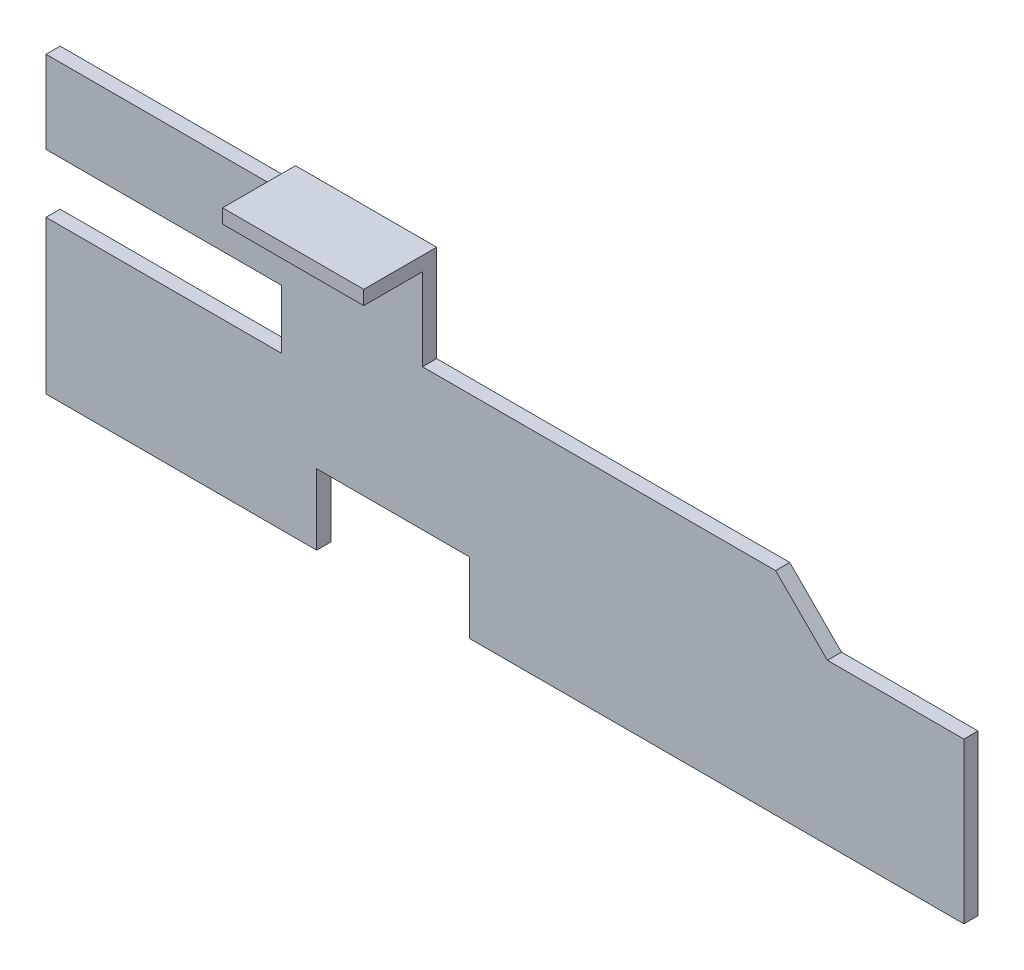
ISO-10303-21;
HEADER;
FILE_DESCRIPTION(('STEP AP214'),'2;1');
FILE_NAME('part.step','',(''),(''),'','','');
FILE_SCHEMA(('AUTOMOTIVE_DESIGN { 1 0 10303 214 1 1 1 1 }'));
ENDSEC;
DATA;
#1=APPLICATION_CONTEXT('core data for automotive mechanical design processes');
#2=APPLICATION_PROTOCOL_DEFINITION('international standard','automotive_design',2000,#1);
#3=PRODUCT_CONTEXT('',#1,'mechanical');
#4=PRODUCT('Part','Part','',(#3));
#5=PRODUCT_RELATED_PRODUCT_CATEGORY('part','',(#4));
#6=PRODUCT_DEFINITION_FORMATION('','',#4);
#7=PRODUCT_DEFINITION_CONTEXT('part definition',#1,'design');
#8=PRODUCT_DEFINITION('design','',#6,#7);
#9=PRODUCT_DEFINITION_SHAPE('','',#8);
#10=(LENGTH_UNIT() NAMED_UNIT(*) SI_UNIT(.MILLI.,.METRE.));
#11=(NAMED_UNIT(*) PLANE_ANGLE_UNIT() SI_UNIT($,.RADIAN.));
#12=(NAMED_UNIT(*) SI_UNIT($,.STERADIAN.) SOLID_ANGLE_UNIT());
#13=UNCERTAINTY_MEASURE_WITH_UNIT(LENGTH_MEASURE(1.E-05),#10,'distance_accuracy_value','');
#14=(GEOMETRIC_REPRESENTATION_CONTEXT(3) GLOBAL_UNCERTAINTY_ASSIGNED_CONTEXT((#13)) GLOBAL_UNIT_ASSIGNED_CONTEXT((#10,
#11,#12)) REPRESENTATION_CONTEXT('',''));
#15=CARTESIAN_POINT('',(0.,0.,0.));
#16=DIRECTION('',(0.,0.,1.));
#17=DIRECTION('',(1.,0.,0.));
#18=AXIS2_PLACEMENT_3D('',#15,#16,#17);
#19=CARTESIAN_POINT('',(0.,6.5,0.6));
#20=DIRECTION('',(1.,0.,0.));
#21=DIRECTION('',(0.,1.,0.));
#22=AXIS2_PLACEMENT_3D('',#19,#20,#21);
#23=PLANE('',#22);
#24=DIRECTION('',(0.,-1.,0.));
#25=VECTOR('',#24,1.);
#26=CARTESIAN_POINT('',(0.,6.5,0.));
#27=LINE('',#26,#25);
#28=CARTESIAN_POINT('',(0.,6.5,0.));
#29=VERTEX_POINT('',#28);
#30=CARTESIAN_POINT('',(0.,0.,0.));
#31=VERTEX_POINT('',#30);
#32=EDGE_CURVE('E185',#29,#31,#27,.T.);
#33=ORIENTED_EDGE('',*,*,#32,.T.);
#34=DIRECTION('',(0.,0.,-1.));
#35=VECTOR('',#34,1.);
#36=CARTESIAN_POINT('',(0.,0.,0.6));
#37=LINE('',#36,#35);
#38=CARTESIAN_POINT('',(0.,0.,0.6));
#39=VERTEX_POINT('',#38);
#40=EDGE_CURVE('E11',#39,#31,#37,.T.);
#41=ORIENTED_EDGE('',*,*,#40,.F.);
#42=DIRECTION('',(0.,-1.,0.));
#43=VECTOR('',#42,1.);
#44=CARTESIAN_POINT('',(0.,6.5,0.6));
#45=LINE('',#44,#43);
#46=CARTESIAN_POINT('',(0.,6.5,0.6));
#47=VERTEX_POINT('',#46);
#48=EDGE_CURVE('E219',#47,#39,#45,.T.);
#49=ORIENTED_EDGE('',*,*,#48,.F.);
#50=DIRECTION('',(0.,0.,-1.));
#51=VECTOR('',#50,1.);
#52=CARTESIAN_POINT('',(0.,6.5,0.6));
#53=LINE('',#52,#51);
#54=EDGE_CURVE('E181',#47,#29,#53,.T.);
#55=ORIENTED_EDGE('',*,*,#54,.T.);
#56=EDGE_LOOP('',(#33,#41,#49,#55));
#57=FACE_BOUND('',#56,.T.);
#58=ADVANCED_FACE('F35',(#57),#23,.F.);
#59=CARTESIAN_POINT('',(0.,0.,0.6));
#60=DIRECTION('',(0.,1.,0.));
#61=DIRECTION('',(0.,0.,1.));
#62=AXIS2_PLACEMENT_3D('',#59,#60,#61);
#63=PLANE('',#62);
#64=DIRECTION('',(1.,0.,0.));
#65=VECTOR('',#64,1.);
#66=CARTESIAN_POINT('',(0.,0.,0.));
#67=LINE('',#66,#65);
#68=CARTESIAN_POINT('',(11.5,0.,0.));
#69=VERTEX_POINT('',#68);
#70=EDGE_CURVE('E188',#31,#69,#67,.T.);
#71=ORIENTED_EDGE('',*,*,#70,.T.);
#72=DIRECTION('',(0.,0.,-1.));
#73=VECTOR('',#72,1.);
#74=CARTESIAN_POINT('',(11.5,0.,0.6));
#75=LINE('',#74,#73);
#76=CARTESIAN_POINT('',(11.5,0.,0.6));
#77=VERTEX_POINT('',#76);
#78=EDGE_CURVE('E44',#77,#69,#75,.T.);
#79=ORIENTED_EDGE('',*,*,#78,.F.);
#80=DIRECTION('',(1.,0.,0.));
#81=VECTOR('',#80,1.);
#82=CARTESIAN_POINT('',(0.,0.,0.6));
#83=LINE('',#82,#81);
#84=EDGE_CURVE('E121',#39,#77,#83,.T.);
#85=ORIENTED_EDGE('',*,*,#84,.F.);
#86=ORIENTED_EDGE('',*,*,#40,.T.);
#87=EDGE_LOOP('',(#71,#79,#85,#86));
#88=FACE_BOUND('',#87,.T.);
#89=ADVANCED_FACE('F298',(#88),#63,.F.);
#90=CARTESIAN_POINT('',(11.5,0.,0.6));
#91=DIRECTION('',(-1.,0.,0.));
#92=DIRECTION('',(0.,0.,1.));
#93=AXIS2_PLACEMENT_3D('',#90,#91,#92);
#94=PLANE('',#93);
#95=DIRECTION('',(0.,1.,0.));
#96=VECTOR('',#95,1.);
#97=CARTESIAN_POINT('',(11.5,0.,0.));
#98=LINE('',#97,#96);
#99=CARTESIAN_POINT('',(11.5,3.,0.));
#100=VERTEX_POINT('',#99);
#101=EDGE_CURVE('E191',#69,#100,#98,.T.);
#102=ORIENTED_EDGE('',*,*,#101,.T.);
#103=DIRECTION('',(0.,0.,-1.));
#104=VECTOR('',#103,1.);
#105=CARTESIAN_POINT('',(11.5,3.,0.6));
#106=LINE('',#105,#104);
#107=CARTESIAN_POINT('',(11.5,3.,0.6));
#108=VERTEX_POINT('',#107);
#109=EDGE_CURVE('E250',#108,#100,#106,.T.);
#110=ORIENTED_EDGE('',*,*,#109,.F.);
#111=DIRECTION('',(0.,1.,0.));
#112=VECTOR('',#111,1.);
#113=CARTESIAN_POINT('',(11.5,0.,0.6));
#114=LINE('',#113,#112);
#115=EDGE_CURVE('E483',#77,#108,#114,.T.);
#116=ORIENTED_EDGE('',*,*,#115,.F.);
#117=ORIENTED_EDGE('',*,*,#78,.T.);
#118=EDGE_LOOP('',(#102,#110,#116,#117));
#119=FACE_BOUND('',#118,.T.);
#120=ADVANCED_FACE('F302',(#119),#94,.F.);
#121=CARTESIAN_POINT('',(11.5,3.,0.6));
#122=DIRECTION('',(0.,1.,0.));
#123=DIRECTION('',(0.,0.,1.));
#124=AXIS2_PLACEMENT_3D('',#121,#122,#123);
#125=PLANE('',#124);
#126=DIRECTION('',(1.,0.,0.));
#127=VECTOR('',#126,1.);
#128=CARTESIAN_POINT('',(11.5,3.,0.));
#129=LINE('',#128,#127);
#130=CARTESIAN_POINT('',(18.,3.,0.));
#131=VERTEX_POINT('',#130);
#132=EDGE_CURVE('E193',#100,#131,#129,.T.);
#133=ORIENTED_EDGE('',*,*,#132,.T.);
#134=DIRECTION('',(0.,0.,-1.));
#135=VECTOR('',#134,1.);
#136=CARTESIAN_POINT('',(18.,3.,0.6));
#137=LINE('',#136,#135);
#138=CARTESIAN_POINT('',(18.,3.,0.6));
#139=VERTEX_POINT('',#138);
#140=EDGE_CURVE('E247',#139,#131,#137,.T.);
#141=ORIENTED_EDGE('',*,*,#140,.F.);
#142=DIRECTION('',(1.,0.,0.));
#143=VECTOR('',#142,1.);
#144=CARTESIAN_POINT('',(11.5,3.,0.6));
#145=LINE('',#144,#143);
#146=EDGE_CURVE('E480',#108,#139,#145,.T.);
#147=ORIENTED_EDGE('',*,*,#146,.F.);
#148=ORIENTED_EDGE('',*,*,#109,.T.);
#149=EDGE_LOOP('',(#133,#141,#147,#148));
#150=FACE_BOUND('',#149,.T.);
#151=ADVANCED_FACE('F306',(#150),#125,.F.);
#152=CARTESIAN_POINT('',(18.,3.,0.6));
#153=DIRECTION('',(1.,0.,0.));
#154=DIRECTION('',(0.,0.,-1.));
#155=AXIS2_PLACEMENT_3D('',#152,#153,#154);
#156=PLANE('',#155);
#157=DIRECTION('',(0.,-1.,0.));
#158=VECTOR('',#157,1.);
#159=CARTESIAN_POINT('',(18.,3.,0.));
#160=LINE('',#159,#158);
#161=CARTESIAN_POINT('',(18.,0.,0.));
#162=VERTEX_POINT('',#161);
#163=EDGE_CURVE('E195',#131,#162,#160,.T.);
#164=ORIENTED_EDGE('',*,*,#163,.T.);
#165=DIRECTION('',(0.,0.,-1.));
#166=VECTOR('',#165,1.);
#167=CARTESIAN_POINT('',(18.,0.,0.6));
#168=LINE('',#167,#166);
#169=CARTESIAN_POINT('',(18.,0.,0.6));
#170=VERTEX_POINT('',#169);
#171=EDGE_CURVE('E244',#170,#162,#168,.T.);
#172=ORIENTED_EDGE('',*,*,#171,.F.);
#173=DIRECTION('',(0.,-1.,0.));
#174=VECTOR('',#173,1.);
#175=CARTESIAN_POINT('',(18.,3.,0.6));
#176=LINE('',#175,#174);
#177=EDGE_CURVE('E477',#139,#170,#176,.T.);
#178=ORIENTED_EDGE('',*,*,#177,.F.);
#179=ORIENTED_EDGE('',*,*,#140,.T.);
#180=EDGE_LOOP('',(#164,#172,#178,#179));
#181=FACE_BOUND('',#180,.T.);
#182=ADVANCED_FACE('F312',(#181),#156,.F.);
#183=CARTESIAN_POINT('',(18.,0.,0.6));
#184=DIRECTION('',(0.,1.,0.));
#185=DIRECTION('',(0.,0.,1.));
#186=AXIS2_PLACEMENT_3D('',#183,#184,#185);
#187=PLANE('',#186);
#188=DIRECTION('',(1.,0.,0.));
#189=VECTOR('',#188,1.);
#190=CARTESIAN_POINT('',(18.,0.,0.));
#191=LINE('',#190,#189);
#192=CARTESIAN_POINT('',(39.,0.,0.));
#193=VERTEX_POINT('',#192);
#194=EDGE_CURVE('E197',#162,#193,#191,.T.);
#195=ORIENTED_EDGE('',*,*,#194,.T.);
#196=DIRECTION('',(0.,0.,-1.));
#197=VECTOR('',#196,1.);
#198=CARTESIAN_POINT('',(39.,0.,0.6));
#199=LINE('',#198,#197);
#200=CARTESIAN_POINT('',(39.,0.,0.6));
#201=VERTEX_POINT('',#200);
#202=EDGE_CURVE('E241',#201,#193,#199,.T.);
#203=ORIENTED_EDGE('',*,*,#202,.F.);
#204=DIRECTION('',(1.,0.,0.));
#205=VECTOR('',#204,1.);
#206=CARTESIAN_POINT('',(18.,0.,0.6));
#207=LINE('',#206,#205);
#208=EDGE_CURVE('E475',#170,#201,#207,.T.);
#209=ORIENTED_EDGE('',*,*,#208,.F.);
#210=ORIENTED_EDGE('',*,*,#171,.T.);
#211=EDGE_LOOP('',(#195,#203,#209,#210));
#212=FACE_BOUND('',#211,.T.);
#213=ADVANCED_FACE('F316',(#212),#187,.F.);
#214=CARTESIAN_POINT('',(39.,0.,0.6));
#215=DIRECTION('',(-1.,0.,0.));
#216=DIRECTION('',(0.,-1.,0.));
#217=AXIS2_PLACEMENT_3D('',#214,#215,#216);
#218=PLANE('',#217);
#219=DIRECTION('',(0.,1.,0.));
#220=VECTOR('',#219,1.);
#221=CARTESIAN_POINT('',(39.,0.,0.));
#222=LINE('',#221,#220);
#223=CARTESIAN_POINT('',(39.,6.8,0.));
#224=VERTEX_POINT('',#223);
#225=EDGE_CURVE('E199',#193,#224,#222,.T.);
#226=ORIENTED_EDGE('',*,*,#225,.T.);
#227=DIRECTION('',(0.,0.,-1.));
#228=VECTOR('',#227,1.);
#229=CARTESIAN_POINT('',(39.,6.8,0.6));
#230=LINE('',#229,#228);
#231=CARTESIAN_POINT('',(39.,6.8,0.6));
#232=VERTEX_POINT('',#231);
#233=EDGE_CURVE('E238',#232,#224,#230,.T.);
#234=ORIENTED_EDGE('',*,*,#233,.F.);
#235=DIRECTION('',(0.,1.,0.));
#236=VECTOR('',#235,1.);
#237=CARTESIAN_POINT('',(39.,0.,0.6));
#238=LINE('',#237,#236);
#239=EDGE_CURVE('E468',#201,#232,#238,.T.);
#240=ORIENTED_EDGE('',*,*,#239,.F.);
#241=ORIENTED_EDGE('',*,*,#202,.T.);
#242=EDGE_LOOP('',(#226,#234,#240,#241));
#243=FACE_BOUND('',#242,.T.);
#244=ADVANCED_FACE('F320',(#243),#218,.F.);
#245=CARTESIAN_POINT('',(39.,6.8,0.6));
#246=DIRECTION('',(0.,-1.,0.));
#247=DIRECTION('',(1.,0.,0.));
#248=AXIS2_PLACEMENT_3D('',#245,#246,#247);
#249=PLANE('',#248);
#250=DIRECTION('',(-1.,0.,0.));
#251=VECTOR('',#250,1.);
#252=CARTESIAN_POINT('',(39.,6.8,0.));
#253=LINE('',#252,#251);
#254=CARTESIAN_POINT('',(33.2,6.8,0.));
#255=VERTEX_POINT('',#254);
#256=EDGE_CURVE('E201',#224,#255,#253,.T.);
#257=ORIENTED_EDGE('',*,*,#256,.T.);
#258=DIRECTION('',(0.,0.,-1.));
#259=VECTOR('',#258,1.);
#260=CARTESIAN_POINT('',(33.2,6.8,0.6));
#261=LINE('',#260,#259);
#262=CARTESIAN_POINT('',(33.2,6.8,0.6));
#263=VERTEX_POINT('',#262);
#264=EDGE_CURVE('E235',#263,#255,#261,.T.);
#265=ORIENTED_EDGE('',*,*,#264,.F.);
#266=DIRECTION('',(-1.,0.,0.));
#267=VECTOR('',#266,1.);
#268=CARTESIAN_POINT('',(39.,6.8,0.6));
#269=LINE('',#268,#267);
#270=EDGE_CURVE('E465',#232,#263,#269,.T.);
#271=ORIENTED_EDGE('',*,*,#270,.F.);
#272=ORIENTED_EDGE('',*,*,#233,.T.);
#273=EDGE_LOOP('',(#257,#265,#271,#272));
#274=FACE_BOUND('',#273,.T.);
#275=ADVANCED_FACE('F324',(#274),#249,.F.);
#276=CARTESIAN_POINT('',(33.2,6.8,0.6));
#277=DIRECTION('',(-0.707106781186547,-0.707106781186548,0.));
#278=DIRECTION('',(0.707106781186548,-0.707106781186547,0.));
#279=AXIS2_PLACEMENT_3D('',#276,#277,#278);
#280=PLANE('',#279);
#281=DIRECTION('',(-0.707106781186548,0.707106781186547,0.));
#282=VECTOR('',#281,1.);
#283=CARTESIAN_POINT('',(33.2,6.8,0.));
#284=LINE('',#283,#282);
#285=CARTESIAN_POINT('',(31.,9.,0.));
#286=VERTEX_POINT('',#285);
#287=EDGE_CURVE('E203',#255,#286,#284,.T.);
#288=ORIENTED_EDGE('',*,*,#287,.T.);
#289=DIRECTION('',(0.,0.,-1.));
#290=VECTOR('',#289,1.);
#291=CARTESIAN_POINT('',(31.,9.,0.6));
#292=LINE('',#291,#290);
#293=CARTESIAN_POINT('',(31.,9.,0.6));
#294=VERTEX_POINT('',#293);
#295=EDGE_CURVE('E232',#294,#286,#292,.T.);
#296=ORIENTED_EDGE('',*,*,#295,.F.);
#297=DIRECTION('',(-0.707106781186548,0.707106781186547,0.));
#298=VECTOR('',#297,1.);
#299=CARTESIAN_POINT('',(33.2,6.8,0.6));
#300=LINE('',#299,#298);
#301=EDGE_CURVE('E463',#263,#294,#300,.T.);
#302=ORIENTED_EDGE('',*,*,#301,.F.);
#303=ORIENTED_EDGE('',*,*,#264,.T.);
#304=EDGE_LOOP('',(#288,#296,#302,#303));
#305=FACE_BOUND('',#304,.T.);
#306=ADVANCED_FACE('F328',(#305),#280,.F.);
#307=CARTESIAN_POINT('',(31.,9.,0.6));
#308=DIRECTION('',(0.,-1.,0.));
#309=DIRECTION('',(1.,0.,0.));
#310=AXIS2_PLACEMENT_3D('',#307,#308,#309);
#311=PLANE('',#310);
#312=DIRECTION('',(-1.,0.,0.));
#313=VECTOR('',#312,1.);
#314=CARTESIAN_POINT('',(31.,9.,0.));
#315=LINE('',#314,#313);
#316=CARTESIAN_POINT('',(16.,8.99999999999999,0.));
#317=VERTEX_POINT('',#316);
#318=EDGE_CURVE('E205',#286,#317,#315,.T.);
#319=ORIENTED_EDGE('',*,*,#318,.T.);
#320=DIRECTION('',(0.,0.,-1.));
#321=VECTOR('',#320,1.);
#322=CARTESIAN_POINT('',(16.,8.99999999999999,0.6));
#323=LINE('',#322,#321);
#324=CARTESIAN_POINT('',(16.,8.99999999999999,0.6));
#325=VERTEX_POINT('',#324);
#326=EDGE_CURVE('E229',#325,#317,#323,.T.);
#327=ORIENTED_EDGE('',*,*,#326,.F.);
#328=DIRECTION('',(-1.,0.,0.));
#329=VECTOR('',#328,1.);
#330=CARTESIAN_POINT('',(31.,9.,0.6));
#331=LINE('',#330,#329);
#332=EDGE_CURVE('E260',#294,#325,#331,.T.);
#333=ORIENTED_EDGE('',*,*,#332,.F.);
#334=ORIENTED_EDGE('',*,*,#295,.T.);
#335=EDGE_LOOP('',(#319,#327,#333,#334));
#336=FACE_BOUND('',#335,.T.);
#337=ADVANCED_FACE('F332',(#336),#311,.F.);
#338=CARTESIAN_POINT('',(16.,8.99999999999999,0.6));
#339=DIRECTION('',(-1.,0.,0.));
#340=DIRECTION('',(0.,0.,1.));
#341=AXIS2_PLACEMENT_3D('',#338,#339,#340);
#342=PLANE('',#341);
#343=DIRECTION('',(0.,1.,0.));
#344=VECTOR('',#343,1.);
#345=CARTESIAN_POINT('',(16.,8.99999999999999,0.));
#346=LINE('',#345,#344);
#347=CARTESIAN_POINT('',(16.,13.1,0.));
#348=VERTEX_POINT('',#347);
#349=EDGE_CURVE('E207',#317,#348,#346,.T.);
#350=ORIENTED_EDGE('',*,*,#349,.T.);
#351=DIRECTION('',(0.,0.,-1.));
#352=VECTOR('',#351,1.);
#353=CARTESIAN_POINT('',(16.,13.1,3.1));
#354=LINE('',#353,#352);
#355=CARTESIAN_POINT('',(16.,13.1,3.1));
#356=VERTEX_POINT('',#355);
#357=EDGE_CURVE('E438',#356,#348,#354,.T.);
#358=ORIENTED_EDGE('',*,*,#357,.F.);
#359=DIRECTION('',(0.,1.,0.));
#360=VECTOR('',#359,1.);
#361=CARTESIAN_POINT('',(16.,12.5,3.1));
#362=LINE('',#361,#360);
#363=CARTESIAN_POINT('',(16.,12.5,3.1));
#364=VERTEX_POINT('',#363);
#365=EDGE_CURVE('E499',#364,#356,#362,.T.);
#366=ORIENTED_EDGE('',*,*,#365,.F.);
#367=DIRECTION('',(0.,0.,-1.));
#368=VECTOR('',#367,1.);
#369=CARTESIAN_POINT('',(16.,12.5,3.1));
#370=LINE('',#369,#368);
#371=CARTESIAN_POINT('',(16.,12.5,0.6));
#372=VERTEX_POINT('',#371);
#373=EDGE_CURVE('E448',#364,#372,#370,.T.);
#374=ORIENTED_EDGE('',*,*,#373,.T.);
#375=DIRECTION('',(0.,1.,0.));
#376=VECTOR('',#375,1.);
#377=CARTESIAN_POINT('',(16.,8.99999999999999,0.6));
#378=LINE('',#377,#376);
#379=EDGE_CURVE('E255',#325,#372,#378,.T.);
#380=ORIENTED_EDGE('',*,*,#379,.F.);
#381=ORIENTED_EDGE('',*,*,#326,.T.);
#382=EDGE_LOOP('',(#350,#358,#366,#374,#380,#381));
#383=FACE_BOUND('',#382,.T.);
#384=ADVANCED_FACE('F336',(#383),#342,.F.);
#385=CARTESIAN_POINT('',(10.,15.,0.6));
#386=DIRECTION('',(1.,0.,0.));
#387=DIRECTION('',(0.,0.,-1.));
#388=AXIS2_PLACEMENT_3D('',#385,#386,#387);
#389=PLANE('',#388);
#390=DIRECTION('',(0.,0.,-1.));
#391=VECTOR('',#390,1.);
#392=CARTESIAN_POINT('',(10.,13.1,3.1));
#393=LINE('',#392,#391);
#394=CARTESIAN_POINT('',(10.,13.1,3.1));
#395=VERTEX_POINT('',#394);
#396=CARTESIAN_POINT('',(10.,13.1,0.));
#397=VERTEX_POINT('',#396);
#398=EDGE_CURVE('E449',#395,#397,#393,.T.);
#399=ORIENTED_EDGE('',*,*,#398,.T.);
#400=DIRECTION('',(0.,-1.,0.));
#401=VECTOR('',#400,1.);
#402=CARTESIAN_POINT('',(10.,15.,0.));
#403=LINE('',#402,#401);
#404=CARTESIAN_POINT('',(10.,12.5,0.));
#405=VERTEX_POINT('',#404);
#406=EDGE_CURVE('E210',#397,#405,#403,.T.);
#407=ORIENTED_EDGE('',*,*,#406,.T.);
#408=DIRECTION('',(0.,0.,-1.));
#409=VECTOR('',#408,1.);
#410=CARTESIAN_POINT('',(10.,12.5,0.6));
#411=LINE('',#410,#409);
#412=CARTESIAN_POINT('',(10.,12.5,0.6));
#413=VERTEX_POINT('',#412);
#414=EDGE_CURVE('E226',#413,#405,#411,.T.);
#415=ORIENTED_EDGE('',*,*,#414,.F.);
#416=DIRECTION('',(0.,0.,-1.));
#417=VECTOR('',#416,1.);
#418=CARTESIAN_POINT('',(10.,12.5,3.1));
#419=LINE('',#418,#417);
#420=CARTESIAN_POINT('',(10.,12.5,3.1));
#421=VERTEX_POINT('',#420);
#422=EDGE_CURVE('E189',#421,#413,#419,.T.);
#423=ORIENTED_EDGE('',*,*,#422,.F.);
#424=DIRECTION('',(0.,-1.,0.));
#425=VECTOR('',#424,1.);
#426=CARTESIAN_POINT('',(10.,12.5,3.1));
#427=LINE('',#426,#425);
#428=EDGE_CURVE('E497',#395,#421,#427,.T.);
#429=ORIENTED_EDGE('',*,*,#428,.F.);
#430=EDGE_LOOP('',(#399,#407,#415,#423,#429));
#431=FACE_BOUND('',#430,.T.);
#432=ADVANCED_FACE('F340',(#431),#389,.F.);
#433=CARTESIAN_POINT('',(10.,12.5,0.6));
#434=DIRECTION('',(0.,-1.,0.));
#435=DIRECTION('',(1.,0.,0.));
#436=AXIS2_PLACEMENT_3D('',#433,#434,#435);
#437=PLANE('',#436);
#438=DIRECTION('',(-1.,0.,0.));
#439=VECTOR('',#438,1.);
#440=CARTESIAN_POINT('',(10.,12.5,0.));
#441=LINE('',#440,#439);
#442=CARTESIAN_POINT('',(0.,12.5,0.));
#443=VERTEX_POINT('',#442);
#444=EDGE_CURVE('E212',#405,#443,#441,.T.);
#445=ORIENTED_EDGE('',*,*,#444,.T.);
#446=DIRECTION('',(0.,0.,-1.));
#447=VECTOR('',#446,1.);
#448=CARTESIAN_POINT('',(0.,12.5,0.6));
#449=LINE('',#448,#447);
#450=CARTESIAN_POINT('',(0.,12.5,0.6));
#451=VERTEX_POINT('',#450);
#452=EDGE_CURVE('E223',#451,#443,#449,.T.);
#453=ORIENTED_EDGE('',*,*,#452,.F.);
#454=DIRECTION('',(-1.,0.,0.));
#455=VECTOR('',#454,1.);
#456=CARTESIAN_POINT('',(10.,12.5,0.6));
#457=LINE('',#456,#455);
#458=EDGE_CURVE('E259',#413,#451,#457,.T.);
#459=ORIENTED_EDGE('',*,*,#458,.F.);
#460=ORIENTED_EDGE('',*,*,#414,.T.);
#461=EDGE_LOOP('',(#445,#453,#459,#460));
#462=FACE_BOUND('',#461,.T.);
#463=ADVANCED_FACE('F274',(#462),#437,.F.);
#464=CARTESIAN_POINT('',(0.,12.5,0.6));
#465=DIRECTION('',(1.,0.,0.));
#466=DIRECTION('',(0.,1.,0.));
#467=AXIS2_PLACEMENT_3D('',#464,#465,#466);
#468=PLANE('',#467);
#469=DIRECTION('',(0.,-1.,0.));
#470=VECTOR('',#469,1.);
#471=CARTESIAN_POINT('',(0.,12.5,0.));
#472=LINE('',#471,#470);
#473=CARTESIAN_POINT('',(0.,9.,0.));
#474=VERTEX_POINT('',#473);
#475=EDGE_CURVE('E214',#443,#474,#472,.T.);
#476=ORIENTED_EDGE('',*,*,#475,.T.);
#477=DIRECTION('',(0.,0.,-1.));
#478=VECTOR('',#477,1.);
#479=CARTESIAN_POINT('',(0.,9.,0.6));
#480=LINE('',#479,#478);
#481=CARTESIAN_POINT('',(0.,9.,0.6));
#482=VERTEX_POINT('',#481);
#483=EDGE_CURVE('E176',#482,#474,#480,.T.);
#484=ORIENTED_EDGE('',*,*,#483,.F.);
#485=DIRECTION('',(0.,-1.,0.));
#486=VECTOR('',#485,1.);
#487=CARTESIAN_POINT('',(0.,12.5,0.6));
#488=LINE('',#487,#486);
#489=EDGE_CURVE('E167',#451,#482,#488,.T.);
#490=ORIENTED_EDGE('',*,*,#489,.F.);
#491=ORIENTED_EDGE('',*,*,#452,.T.);
#492=EDGE_LOOP('',(#476,#484,#490,#491));
#493=FACE_BOUND('',#492,.T.);
#494=ADVANCED_FACE('F278',(#493),#468,.F.);
#495=CARTESIAN_POINT('',(0.,9.,0.6));
#496=DIRECTION('',(0.,1.,0.));
#497=DIRECTION('',(0.,0.,1.));
#498=AXIS2_PLACEMENT_3D('',#495,#496,#497);
#499=PLANE('',#498);
#500=DIRECTION('',(1.,0.,0.));
#501=VECTOR('',#500,1.);
#502=CARTESIAN_POINT('',(0.,9.,0.));
#503=LINE('',#502,#501);
#504=CARTESIAN_POINT('',(10.,9.,0.));
#505=VERTEX_POINT('',#504);
#506=EDGE_CURVE('E175',#474,#505,#503,.T.);
#507=ORIENTED_EDGE('',*,*,#506,.T.);
#508=DIRECTION('',(0.,0.,-1.));
#509=VECTOR('',#508,1.);
#510=CARTESIAN_POINT('',(10.,9.,0.6));
#511=LINE('',#510,#509);
#512=CARTESIAN_POINT('',(10.,9.,0.6));
#513=VERTEX_POINT('',#512);
#514=EDGE_CURVE('E172',#513,#505,#511,.T.);
#515=ORIENTED_EDGE('',*,*,#514,.F.);
#516=DIRECTION('',(1.,0.,0.));
#517=VECTOR('',#516,1.);
#518=CARTESIAN_POINT('',(0.,9.,0.6));
#519=LINE('',#518,#517);
#520=EDGE_CURVE('E161',#482,#513,#519,.T.);
#521=ORIENTED_EDGE('',*,*,#520,.F.);
#522=ORIENTED_EDGE('',*,*,#483,.T.);
#523=EDGE_LOOP('',(#507,#515,#521,#522));
#524=FACE_BOUND('',#523,.T.);
#525=ADVANCED_FACE('F173',(#524),#499,.F.);
#526=CARTESIAN_POINT('',(10.,9.,0.6));
#527=DIRECTION('',(1.,0.,0.));
#528=DIRECTION('',(0.,0.,-1.));
#529=AXIS2_PLACEMENT_3D('',#526,#527,#528);
#530=PLANE('',#529);
#531=DIRECTION('',(0.,-1.,0.));
#532=VECTOR('',#531,1.);
#533=CARTESIAN_POINT('',(10.,9.,0.));
#534=LINE('',#533,#532);
#535=CARTESIAN_POINT('',(10.,6.5,0.));
#536=VERTEX_POINT('',#535);
#537=EDGE_CURVE('E107',#505,#536,#534,.T.);
#538=ORIENTED_EDGE('',*,*,#537,.T.);
#539=DIRECTION('',(0.,0.,-1.));
#540=VECTOR('',#539,1.);
#541=CARTESIAN_POINT('',(10.,6.5,0.6));
#542=LINE('',#541,#540);
#543=CARTESIAN_POINT('',(10.,6.5,0.6));
#544=VERTEX_POINT('',#543);
#545=EDGE_CURVE('E177',#544,#536,#542,.T.);
#546=ORIENTED_EDGE('',*,*,#545,.F.);
#547=DIRECTION('',(0.,-1.,0.));
#548=VECTOR('',#547,1.);
#549=CARTESIAN_POINT('',(10.,9.,0.6));
#550=LINE('',#549,#548);
#551=EDGE_CURVE('E165',#513,#544,#550,.T.);
#552=ORIENTED_EDGE('',*,*,#551,.F.);
#553=ORIENTED_EDGE('',*,*,#514,.T.);
#554=EDGE_LOOP('',(#538,#546,#552,#553));
#555=FACE_BOUND('',#554,.T.);
#556=ADVANCED_FACE('F179',(#555),#530,.F.);
#557=CARTESIAN_POINT('',(10.,6.5,0.6));
#558=DIRECTION('',(0.,-1.,0.));
#559=DIRECTION('',(1.,0.,0.));
#560=AXIS2_PLACEMENT_3D('',#557,#558,#559);
#561=PLANE('',#560);
#562=DIRECTION('',(-1.,0.,0.));
#563=VECTOR('',#562,1.);
#564=CARTESIAN_POINT('',(10.,6.5,0.));
#565=LINE('',#564,#563);
#566=EDGE_CURVE('E113',#536,#29,#565,.T.);
#567=ORIENTED_EDGE('',*,*,#566,.T.);
#568=ORIENTED_EDGE('',*,*,#54,.F.);
#569=DIRECTION('',(-1.,0.,0.));
#570=VECTOR('',#569,1.);
#571=CARTESIAN_POINT('',(10.,6.5,0.6));
#572=LINE('',#571,#570);
#573=EDGE_CURVE('E53',#544,#47,#572,.T.);
#574=ORIENTED_EDGE('',*,*,#573,.F.);
#575=ORIENTED_EDGE('',*,*,#545,.T.);
#576=EDGE_LOOP('',(#567,#568,#574,#575));
#577=FACE_BOUND('',#576,.T.);
#578=ADVANCED_FACE('F287',(#577),#561,.F.);
#579=CARTESIAN_POINT('',(0.,0.,0.6));
#580=DIRECTION('',(0.,0.,1.));
#581=DIRECTION('',(1.,0.,0.));
#582=AXIS2_PLACEMENT_3D('',#579,#580,#581);
#583=PLANE('',#582);
#584=DIRECTION('',(1.,0.,0.));
#585=VECTOR('',#584,1.);
#586=CARTESIAN_POINT('',(10.,12.5,0.6));
#587=LINE('',#586,#585);
#588=EDGE_CURVE('E261',#413,#372,#587,.T.);
#589=ORIENTED_EDGE('',*,*,#588,.F.);
#590=ORIENTED_EDGE('',*,*,#458,.T.);
#591=ORIENTED_EDGE('',*,*,#489,.T.);
#592=ORIENTED_EDGE('',*,*,#520,.T.);
#593=ORIENTED_EDGE('',*,*,#551,.T.);
#594=ORIENTED_EDGE('',*,*,#573,.T.);
#595=ORIENTED_EDGE('',*,*,#48,.T.);
#596=ORIENTED_EDGE('',*,*,#84,.T.);
#597=ORIENTED_EDGE('',*,*,#115,.T.);
#598=ORIENTED_EDGE('',*,*,#146,.T.);
#599=ORIENTED_EDGE('',*,*,#177,.T.);
#600=ORIENTED_EDGE('',*,*,#208,.T.);
#601=ORIENTED_EDGE('',*,*,#239,.T.);
#602=ORIENTED_EDGE('',*,*,#270,.T.);
#603=ORIENTED_EDGE('',*,*,#301,.T.);
#604=ORIENTED_EDGE('',*,*,#332,.T.);
#605=ORIENTED_EDGE('',*,*,#379,.T.);
#606=EDGE_LOOP('',(#589,#590,#591,#592,#593,#594,#595,#596,#597,#598,#599,#600,#601,#602,#603,
#604,#605));
#607=FACE_BOUND('',#606,.T.);
#608=ADVANCED_FACE('F163',(#607),#583,.T.);
#609=CARTESIAN_POINT('',(0.,0.,0.));
#610=DIRECTION('',(0.,0.,1.));
#611=DIRECTION('',(1.,0.,0.));
#612=AXIS2_PLACEMENT_3D('',#609,#610,#611);
#613=PLANE('',#612);
#614=ORIENTED_EDGE('',*,*,#406,.F.);
#615=DIRECTION('',(1.,0.,0.));
#616=VECTOR('',#615,1.);
#617=CARTESIAN_POINT('',(10.,13.1,0.));
#618=LINE('',#617,#616);
#619=EDGE_CURVE('E442',#397,#348,#618,.T.);
#620=ORIENTED_EDGE('',*,*,#619,.T.);
#621=ORIENTED_EDGE('',*,*,#349,.F.);
#622=ORIENTED_EDGE('',*,*,#318,.F.);
#623=ORIENTED_EDGE('',*,*,#287,.F.);
#624=ORIENTED_EDGE('',*,*,#256,.F.);
#625=ORIENTED_EDGE('',*,*,#225,.F.);
#626=ORIENTED_EDGE('',*,*,#194,.F.);
#627=ORIENTED_EDGE('',*,*,#163,.F.);
#628=ORIENTED_EDGE('',*,*,#132,.F.);
#629=ORIENTED_EDGE('',*,*,#101,.F.);
#630=ORIENTED_EDGE('',*,*,#70,.F.);
#631=ORIENTED_EDGE('',*,*,#32,.F.);
#632=ORIENTED_EDGE('',*,*,#566,.F.);
#633=ORIENTED_EDGE('',*,*,#537,.F.);
#634=ORIENTED_EDGE('',*,*,#506,.F.);
#635=ORIENTED_EDGE('',*,*,#475,.F.);
#636=ORIENTED_EDGE('',*,*,#444,.F.);
#637=EDGE_LOOP('',(#614,#620,#621,#622,#623,#624,#625,#626,#627,#628,#629,#630,#631,#632,#633,
#634,#635,#636));
#638=FACE_BOUND('',#637,.T.);
#639=ADVANCED_FACE('F281',(#638),#613,.F.);
#640=CARTESIAN_POINT('',(10.,12.5,3.1));
#641=DIRECTION('',(0.,1.,0.));
#642=DIRECTION('',(-1.,0.,0.));
#643=AXIS2_PLACEMENT_3D('',#640,#641,#642);
#644=PLANE('',#643);
#645=ORIENTED_EDGE('',*,*,#588,.T.);
#646=ORIENTED_EDGE('',*,*,#373,.F.);
#647=DIRECTION('',(1.,0.,0.));
#648=VECTOR('',#647,1.);
#649=CARTESIAN_POINT('',(10.,12.5,3.1));
#650=LINE('',#649,#648);
#651=EDGE_CURVE('E510',#421,#364,#650,.T.);
#652=ORIENTED_EDGE('',*,*,#651,.F.);
#653=ORIENTED_EDGE('',*,*,#422,.T.);
#654=EDGE_LOOP('',(#645,#646,#652,#653));
#655=FACE_BOUND('',#654,.T.);
#656=ADVANCED_FACE('F383',(#655),#644,.F.);
#657=CARTESIAN_POINT('',(10.,13.1,3.1));
#658=DIRECTION('',(0.,-1.,0.));
#659=DIRECTION('',(1.,0.,0.));
#660=AXIS2_PLACEMENT_3D('',#657,#658,#659);
#661=PLANE('',#660);
#662=ORIENTED_EDGE('',*,*,#357,.T.);
#663=ORIENTED_EDGE('',*,*,#619,.F.);
#664=ORIENTED_EDGE('',*,*,#398,.F.);
#665=DIRECTION('',(-1.,0.,0.));
#666=VECTOR('',#665,1.);
#667=CARTESIAN_POINT('',(10.,13.1,3.1));
#668=LINE('',#667,#666);
#669=EDGE_CURVE('E445',#356,#395,#668,.T.);
#670=ORIENTED_EDGE('',*,*,#669,.F.);
#671=EDGE_LOOP('',(#662,#663,#664,#670));
#672=FACE_BOUND('',#671,.T.);
#673=ADVANCED_FACE('F388',(#672),#661,.F.);
#674=CARTESIAN_POINT('',(0.,0.,3.1));
#675=DIRECTION('',(0.,0.,-1.));
#676=DIRECTION('',(-1.,0.,0.));
#677=AXIS2_PLACEMENT_3D('',#674,#675,#676);
#678=PLANE('',#677);
#679=ORIENTED_EDGE('',*,*,#428,.T.);
#680=ORIENTED_EDGE('',*,*,#651,.T.);
#681=ORIENTED_EDGE('',*,*,#365,.T.);
#682=ORIENTED_EDGE('',*,*,#669,.T.);
#683=EDGE_LOOP('',(#679,#680,#681,#682));
#684=FACE_BOUND('',#683,.T.);
#685=ADVANCED_FACE('F397',(#684),#678,.F.);
#686=CLOSED_SHELL('',(#58,#89,#120,#151,#182,#213,#244,#275,#306,#337,#384,#432,#463,#494,#525,
#556,#578,#608,#639,#656,#673,#685));
#687=MANIFOLD_SOLID_BREP('B2',#686);
#688=ADVANCED_BREP_SHAPE_REPRESENTATION('',(#18,#687),#14);
#689=SHAPE_DEFINITION_REPRESENTATION(#9,#688);
ENDSEC;
END-ISO-10303-21;
